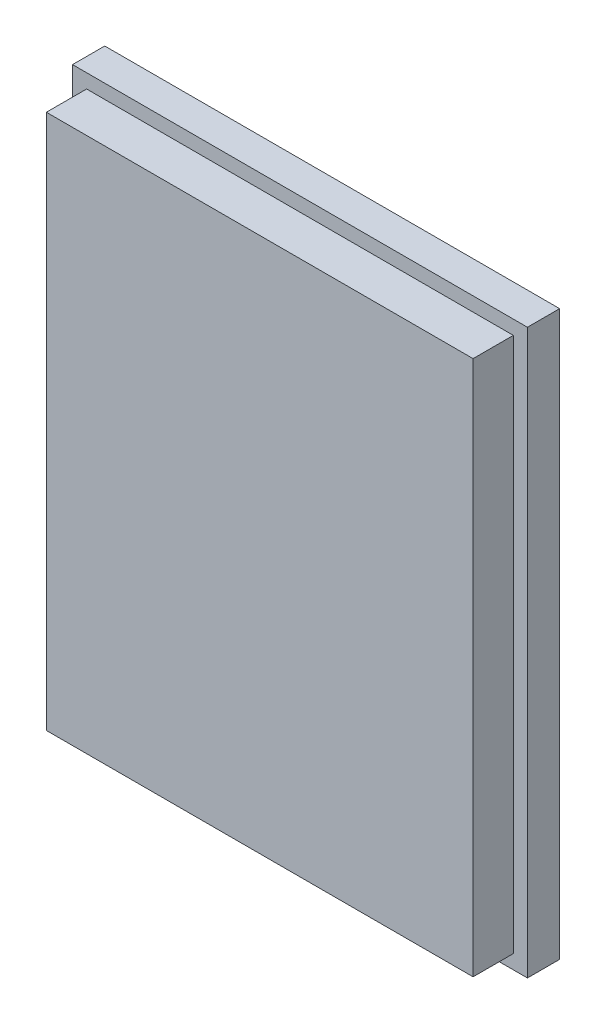
ISO-10303-21;
HEADER;
FILE_DESCRIPTION(('STEP AP214'),'2;1');
FILE_NAME('part.step','',(''),(''),'','','');
FILE_SCHEMA(('AUTOMOTIVE_DESIGN { 1 0 10303 214 1 1 1 1 }'));
ENDSEC;
DATA;
#1=APPLICATION_CONTEXT('core data for automotive mechanical design processes');
#2=APPLICATION_PROTOCOL_DEFINITION('international standard','automotive_design',2000,#1);
#3=PRODUCT_CONTEXT('',#1,'mechanical');
#4=PRODUCT('Part','Part','',(#3));
#5=PRODUCT_RELATED_PRODUCT_CATEGORY('part','',(#4));
#6=PRODUCT_DEFINITION_FORMATION('','',#4);
#7=PRODUCT_DEFINITION_CONTEXT('part definition',#1,'design');
#8=PRODUCT_DEFINITION('design','',#6,#7);
#9=PRODUCT_DEFINITION_SHAPE('','',#8);
#10=(LENGTH_UNIT() NAMED_UNIT(*) SI_UNIT(.MILLI.,.METRE.));
#11=(NAMED_UNIT(*) PLANE_ANGLE_UNIT() SI_UNIT($,.RADIAN.));
#12=(NAMED_UNIT(*) SI_UNIT($,.STERADIAN.) SOLID_ANGLE_UNIT());
#13=UNCERTAINTY_MEASURE_WITH_UNIT(LENGTH_MEASURE(1.E-05),#10,'distance_accuracy_value','');
#14=(GEOMETRIC_REPRESENTATION_CONTEXT(3) GLOBAL_UNCERTAINTY_ASSIGNED_CONTEXT((#13)) GLOBAL_UNIT_ASSIGNED_CONTEXT((#10,
#11,#12)) REPRESENTATION_CONTEXT('',''));
#15=CARTESIAN_POINT('',(0.,0.,0.));
#16=DIRECTION('',(0.,0.,1.));
#17=DIRECTION('',(1.,0.,0.));
#18=AXIS2_PLACEMENT_3D('',#15,#16,#17);
#19=CARTESIAN_POINT('',(9.05,50.55,2.966800003052));
#20=DIRECTION('',(0.,0.,1.));
#21=DIRECTION('',(1.,0.,0.));
#22=AXIS2_PLACEMENT_3D('',#19,#20,#21);
#23=PLANE('',#22);
#24=DIRECTION('',(-1.,0.,0.));
#25=VECTOR('',#24,1.);
#26=CARTESIAN_POINT('',(9.05,37.25,2.966800003052));
#27=LINE('',#26,#25);
#28=CARTESIAN_POINT('',(19.65,37.25,2.966800003052));
#29=VERTEX_POINT('',#28);
#30=CARTESIAN_POINT('',(9.05,37.25,2.966800003052));
#31=VERTEX_POINT('',#30);
#32=EDGE_CURVE('E11',#29,#31,#27,.T.);
#33=ORIENTED_EDGE('',*,*,#32,.F.);
#34=DIRECTION('',(0.,-1.,0.));
#35=VECTOR('',#34,1.);
#36=CARTESIAN_POINT('',(19.65,50.55,2.966800003052));
#37=LINE('',#36,#35);
#38=CARTESIAN_POINT('',(19.65,50.55,2.966800003052));
#39=VERTEX_POINT('',#38);
#40=EDGE_CURVE('E140',#39,#29,#37,.T.);
#41=ORIENTED_EDGE('',*,*,#40,.F.);
#42=DIRECTION('',(-1.,0.,0.));
#43=VECTOR('',#42,1.);
#44=CARTESIAN_POINT('',(9.05,50.55,2.966800003052));
#45=LINE('',#44,#43);
#46=CARTESIAN_POINT('',(9.05,50.55,2.966800003052));
#47=VERTEX_POINT('',#46);
#48=EDGE_CURVE('E156',#39,#47,#45,.T.);
#49=ORIENTED_EDGE('',*,*,#48,.T.);
#50=DIRECTION('',(0.,-1.,0.));
#51=VECTOR('',#50,1.);
#52=CARTESIAN_POINT('',(9.05,50.55,2.966800003052));
#53=LINE('',#52,#51);
#54=EDGE_CURVE('E131',#47,#31,#53,.T.);
#55=ORIENTED_EDGE('',*,*,#54,.T.);
#56=EDGE_LOOP('',(#33,#41,#49,#55));
#57=FACE_BOUND('',#56,.T.);
#58=ADVANCED_FACE('F17',(#57),#23,.T.);
#59=CARTESIAN_POINT('',(9.05,37.25,1.966800003052));
#60=DIRECTION('',(0.,-1.,0.));
#61=DIRECTION('',(-1.,0.,0.));
#62=AXIS2_PLACEMENT_3D('',#59,#60,#61);
#63=PLANE('',#62);
#64=DIRECTION('',(0.,0.,-1.));
#65=VECTOR('',#64,1.);
#66=CARTESIAN_POINT('',(19.65,37.25,1.966800003052));
#67=LINE('',#66,#65);
#68=CARTESIAN_POINT('',(19.65,37.25,1.966800003052));
#69=VERTEX_POINT('',#68);
#70=EDGE_CURVE('E119',#29,#69,#67,.T.);
#71=ORIENTED_EDGE('',*,*,#70,.F.);
#72=ORIENTED_EDGE('',*,*,#32,.T.);
#73=DIRECTION('',(0.,0.,-1.));
#74=VECTOR('',#73,1.);
#75=CARTESIAN_POINT('',(9.05,37.25,1.966800003052));
#76=LINE('',#75,#74);
#77=CARTESIAN_POINT('',(9.05,37.25,1.966800003052));
#78=VERTEX_POINT('',#77);
#79=EDGE_CURVE('E21',#31,#78,#76,.T.);
#80=ORIENTED_EDGE('',*,*,#79,.T.);
#81=DIRECTION('',(-1.,0.,0.));
#82=VECTOR('',#81,1.);
#83=CARTESIAN_POINT('',(8.7,37.25,1.966800003052));
#84=LINE('',#83,#82);
#85=EDGE_CURVE('E126',#69,#78,#84,.T.);
#86=ORIENTED_EDGE('',*,*,#85,.F.);
#87=EDGE_LOOP('',(#71,#72,#80,#86));
#88=FACE_BOUND('',#87,.T.);
#89=ADVANCED_FACE('F124',(#88),#63,.T.);
#90=CARTESIAN_POINT('',(9.05,50.55,1.966800003052));
#91=DIRECTION('',(1.,0.,0.));
#92=DIRECTION('',(0.,-1.,0.));
#93=AXIS2_PLACEMENT_3D('',#90,#91,#92);
#94=PLANE('',#93);
#95=ORIENTED_EDGE('',*,*,#54,.F.);
#96=DIRECTION('',(0.,0.,-1.));
#97=VECTOR('',#96,1.);
#98=CARTESIAN_POINT('',(9.05,50.55,1.966800003052));
#99=LINE('',#98,#97);
#100=CARTESIAN_POINT('',(9.05,50.55,1.966800003052));
#101=VERTEX_POINT('',#100);
#102=EDGE_CURVE('E135',#47,#101,#99,.T.);
#103=ORIENTED_EDGE('',*,*,#102,.T.);
#104=DIRECTION('',(0.,1.,0.));
#105=VECTOR('',#104,1.);
#106=CARTESIAN_POINT('',(9.05,50.9,1.966800003052));
#107=LINE('',#106,#105);
#108=EDGE_CURVE('E133',#78,#101,#107,.T.);
#109=ORIENTED_EDGE('',*,*,#108,.F.);
#110=ORIENTED_EDGE('',*,*,#79,.F.);
#111=EDGE_LOOP('',(#95,#103,#109,#110));
#112=FACE_BOUND('',#111,.T.);
#113=ADVANCED_FACE('F19',(#112),#94,.F.);
#114=CARTESIAN_POINT('',(9.05,50.55,1.966800003052));
#115=DIRECTION('',(0.,-1.,0.));
#116=DIRECTION('',(-1.,0.,0.));
#117=AXIS2_PLACEMENT_3D('',#114,#115,#116);
#118=PLANE('',#117);
#119=DIRECTION('',(0.,0.,1.));
#120=VECTOR('',#119,1.);
#121=CARTESIAN_POINT('',(19.65,50.55,1.966800003052));
#122=LINE('',#121,#120);
#123=CARTESIAN_POINT('',(19.65,50.55,1.966800003052));
#124=VERTEX_POINT('',#123);
#125=EDGE_CURVE('E165',#124,#39,#122,.T.);
#126=ORIENTED_EDGE('',*,*,#125,.F.);
#127=DIRECTION('',(1.,0.,0.));
#128=VECTOR('',#127,1.);
#129=CARTESIAN_POINT('',(8.7,50.55,1.966800003052));
#130=LINE('',#129,#128);
#131=EDGE_CURVE('E150',#101,#124,#130,.T.);
#132=ORIENTED_EDGE('',*,*,#131,.F.);
#133=ORIENTED_EDGE('',*,*,#102,.F.);
#134=ORIENTED_EDGE('',*,*,#48,.F.);
#135=EDGE_LOOP('',(#126,#132,#133,#134));
#136=FACE_BOUND('',#135,.T.);
#137=ADVANCED_FACE('F179',(#136),#118,.F.);
#138=CARTESIAN_POINT('',(19.65,50.55,1.966800003052));
#139=DIRECTION('',(1.,0.,0.));
#140=DIRECTION('',(0.,-1.,0.));
#141=AXIS2_PLACEMENT_3D('',#138,#139,#140);
#142=PLANE('',#141);
#143=ORIENTED_EDGE('',*,*,#40,.T.);
#144=ORIENTED_EDGE('',*,*,#70,.T.);
#145=DIRECTION('',(0.,-1.,0.));
#146=VECTOR('',#145,1.);
#147=CARTESIAN_POINT('',(19.65,50.9,1.966800003052));
#148=LINE('',#147,#146);
#149=EDGE_CURVE('E143',#124,#69,#148,.T.);
#150=ORIENTED_EDGE('',*,*,#149,.F.);
#151=ORIENTED_EDGE('',*,*,#125,.T.);
#152=EDGE_LOOP('',(#143,#144,#150,#151));
#153=FACE_BOUND('',#152,.T.);
#154=ADVANCED_FACE('F282',(#153),#142,.T.);
#155=CARTESIAN_POINT('',(8.7,50.9,1.966800003052));
#156=DIRECTION('',(0.,0.,1.));
#157=DIRECTION('',(1.,0.,0.));
#158=AXIS2_PLACEMENT_3D('',#155,#156,#157);
#159=PLANE('',#158);
#160=DIRECTION('',(-1.,0.,0.));
#161=VECTOR('',#160,1.);
#162=CARTESIAN_POINT('',(8.7,36.9,1.966800003052));
#163=LINE('',#162,#161);
#164=CARTESIAN_POINT('',(20.,36.9,1.966800003052));
#165=VERTEX_POINT('',#164);
#166=CARTESIAN_POINT('',(8.7,36.9,1.966800003052));
#167=VERTEX_POINT('',#166);
#168=EDGE_CURVE('E57',#165,#167,#163,.T.);
#169=ORIENTED_EDGE('',*,*,#168,.F.);
#170=DIRECTION('',(0.,-1.,0.));
#171=VECTOR('',#170,1.);
#172=CARTESIAN_POINT('',(20.,50.9,1.966800003052));
#173=LINE('',#172,#171);
#174=CARTESIAN_POINT('',(20.,50.9,1.966800003052));
#175=VERTEX_POINT('',#174);
#176=EDGE_CURVE('E199',#175,#165,#173,.T.);
#177=ORIENTED_EDGE('',*,*,#176,.F.);
#178=DIRECTION('',(-1.,0.,0.));
#179=VECTOR('',#178,1.);
#180=CARTESIAN_POINT('',(8.7,50.9,1.966800003052));
#181=LINE('',#180,#179);
#182=CARTESIAN_POINT('',(8.7,50.9,1.966800003052));
#183=VERTEX_POINT('',#182);
#184=EDGE_CURVE('E72',#175,#183,#181,.T.);
#185=ORIENTED_EDGE('',*,*,#184,.T.);
#186=DIRECTION('',(0.,-1.,0.));
#187=VECTOR('',#186,1.);
#188=CARTESIAN_POINT('',(8.7,50.9,1.966800003052));
#189=LINE('',#188,#187);
#190=EDGE_CURVE('E160',#183,#167,#189,.T.);
#191=ORIENTED_EDGE('',*,*,#190,.T.);
#192=EDGE_LOOP('',(#169,#177,#185,#191));
#193=FACE_BOUND('',#192,.T.);
#194=ORIENTED_EDGE('',*,*,#131,.T.);
#195=ORIENTED_EDGE('',*,*,#149,.T.);
#196=ORIENTED_EDGE('',*,*,#85,.T.);
#197=ORIENTED_EDGE('',*,*,#108,.T.);
#198=EDGE_LOOP('',(#194,#195,#196,#197));
#199=FACE_BOUND('',#198,.T.);
#200=ADVANCED_FACE('F142',(#193,#199),#159,.T.);
#201=CARTESIAN_POINT('',(8.7,50.9,1.166800003052));
#202=DIRECTION('',(0.,-1.,0.));
#203=DIRECTION('',(-1.,0.,0.));
#204=AXIS2_PLACEMENT_3D('',#201,#202,#203);
#205=PLANE('',#204);
#206=DIRECTION('',(0.,0.,1.));
#207=VECTOR('',#206,1.);
#208=CARTESIAN_POINT('',(20.,50.9,1.166800003052));
#209=LINE('',#208,#207);
#210=CARTESIAN_POINT('',(20.,50.9,1.166800003052));
#211=VERTEX_POINT('',#210);
#212=EDGE_CURVE('E188',#211,#175,#209,.T.);
#213=ORIENTED_EDGE('',*,*,#212,.F.);
#214=DIRECTION('',(-1.,0.,0.));
#215=VECTOR('',#214,1.);
#216=CARTESIAN_POINT('',(8.7,50.9,1.166800003052));
#217=LINE('',#216,#215);
#218=CARTESIAN_POINT('',(8.7,50.9,1.166800003052));
#219=VERTEX_POINT('',#218);
#220=EDGE_CURVE('E167',#211,#219,#217,.T.);
#221=ORIENTED_EDGE('',*,*,#220,.T.);
#222=DIRECTION('',(0.,0.,1.));
#223=VECTOR('',#222,1.);
#224=CARTESIAN_POINT('',(8.7,50.9,1.166800003052));
#225=LINE('',#224,#223);
#226=EDGE_CURVE('E163',#219,#183,#225,.T.);
#227=ORIENTED_EDGE('',*,*,#226,.T.);
#228=ORIENTED_EDGE('',*,*,#184,.F.);
#229=EDGE_LOOP('',(#213,#221,#227,#228));
#230=FACE_BOUND('',#229,.T.);
#231=ADVANCED_FACE('F216',(#230),#205,.F.);
#232=CARTESIAN_POINT('',(8.7,50.9,1.166800003052));
#233=DIRECTION('',(1.,0.,0.));
#234=DIRECTION('',(0.,-1.,0.));
#235=AXIS2_PLACEMENT_3D('',#232,#233,#234);
#236=PLANE('',#235);
#237=ORIENTED_EDGE('',*,*,#190,.F.);
#238=ORIENTED_EDGE('',*,*,#226,.F.);
#239=DIRECTION('',(0.,-1.,0.));
#240=VECTOR('',#239,1.);
#241=CARTESIAN_POINT('',(8.7,50.9,1.166800003052));
#242=LINE('',#241,#240);
#243=CARTESIAN_POINT('',(8.7,36.9,1.166800003052));
#244=VERTEX_POINT('',#243);
#245=EDGE_CURVE('E171',#219,#244,#242,.T.);
#246=ORIENTED_EDGE('',*,*,#245,.T.);
#247=DIRECTION('',(0.,0.,-1.));
#248=VECTOR('',#247,1.);
#249=CARTESIAN_POINT('',(8.7,36.9,1.166800003052));
#250=LINE('',#249,#248);
#251=EDGE_CURVE('E95',#167,#244,#250,.T.);
#252=ORIENTED_EDGE('',*,*,#251,.F.);
#253=EDGE_LOOP('',(#237,#238,#246,#252));
#254=FACE_BOUND('',#253,.T.);
#255=ADVANCED_FACE('F220',(#254),#236,.F.);
#256=CARTESIAN_POINT('',(8.7,36.9,1.166800003052));
#257=DIRECTION('',(0.,-1.,0.));
#258=DIRECTION('',(-1.,0.,0.));
#259=AXIS2_PLACEMENT_3D('',#256,#257,#258);
#260=PLANE('',#259);
#261=DIRECTION('',(0.,0.,-1.));
#262=VECTOR('',#261,1.);
#263=CARTESIAN_POINT('',(20.,36.9,1.166800003052));
#264=LINE('',#263,#262);
#265=CARTESIAN_POINT('',(20.,36.9,1.166800003052));
#266=VERTEX_POINT('',#265);
#267=EDGE_CURVE('E84',#165,#266,#264,.T.);
#268=ORIENTED_EDGE('',*,*,#267,.F.);
#269=ORIENTED_EDGE('',*,*,#168,.T.);
#270=ORIENTED_EDGE('',*,*,#251,.T.);
#271=DIRECTION('',(1.,0.,0.));
#272=VECTOR('',#271,1.);
#273=CARTESIAN_POINT('',(8.7,36.9,1.166800003052));
#274=LINE('',#273,#272);
#275=EDGE_CURVE('E154',#244,#266,#274,.T.);
#276=ORIENTED_EDGE('',*,*,#275,.T.);
#277=EDGE_LOOP('',(#268,#269,#270,#276));
#278=FACE_BOUND('',#277,.T.);
#279=ADVANCED_FACE('F306',(#278),#260,.T.);
#280=CARTESIAN_POINT('',(20.,50.9,1.166800003052));
#281=DIRECTION('',(1.,0.,0.));
#282=DIRECTION('',(0.,-1.,0.));
#283=AXIS2_PLACEMENT_3D('',#280,#281,#282);
#284=PLANE('',#283);
#285=ORIENTED_EDGE('',*,*,#176,.T.);
#286=ORIENTED_EDGE('',*,*,#267,.T.);
#287=DIRECTION('',(0.,1.,0.));
#288=VECTOR('',#287,1.);
#289=CARTESIAN_POINT('',(20.,50.9,1.166800003052));
#290=LINE('',#289,#288);
#291=EDGE_CURVE('E170',#266,#211,#290,.T.);
#292=ORIENTED_EDGE('',*,*,#291,.T.);
#293=ORIENTED_EDGE('',*,*,#212,.T.);
#294=EDGE_LOOP('',(#285,#286,#292,#293));
#295=FACE_BOUND('',#294,.T.);
#296=ADVANCED_FACE('F214',(#295),#284,.T.);
#297=CARTESIAN_POINT('',(8.7,50.9,1.166800003052));
#298=DIRECTION('',(0.,0.,1.));
#299=DIRECTION('',(1.,0.,0.));
#300=AXIS2_PLACEMENT_3D('',#297,#298,#299);
#301=PLANE('',#300);
#302=ORIENTED_EDGE('',*,*,#275,.F.);
#303=ORIENTED_EDGE('',*,*,#245,.F.);
#304=ORIENTED_EDGE('',*,*,#220,.F.);
#305=ORIENTED_EDGE('',*,*,#291,.F.);
#306=EDGE_LOOP('',(#302,#303,#304,#305));
#307=FACE_BOUND('',#306,.T.);
#308=ADVANCED_FACE('F223',(#307),#301,.F.);
#309=CLOSED_SHELL('',(#58,#89,#113,#137,#154,#200,#231,#255,#279,#296,#308));
#310=MANIFOLD_SOLID_BREP('B1',#309);
#311=ADVANCED_BREP_SHAPE_REPRESENTATION('',(#18,#310),#14);
#312=SHAPE_DEFINITION_REPRESENTATION(#9,#311);
ENDSEC;
END-ISO-10303-21;
